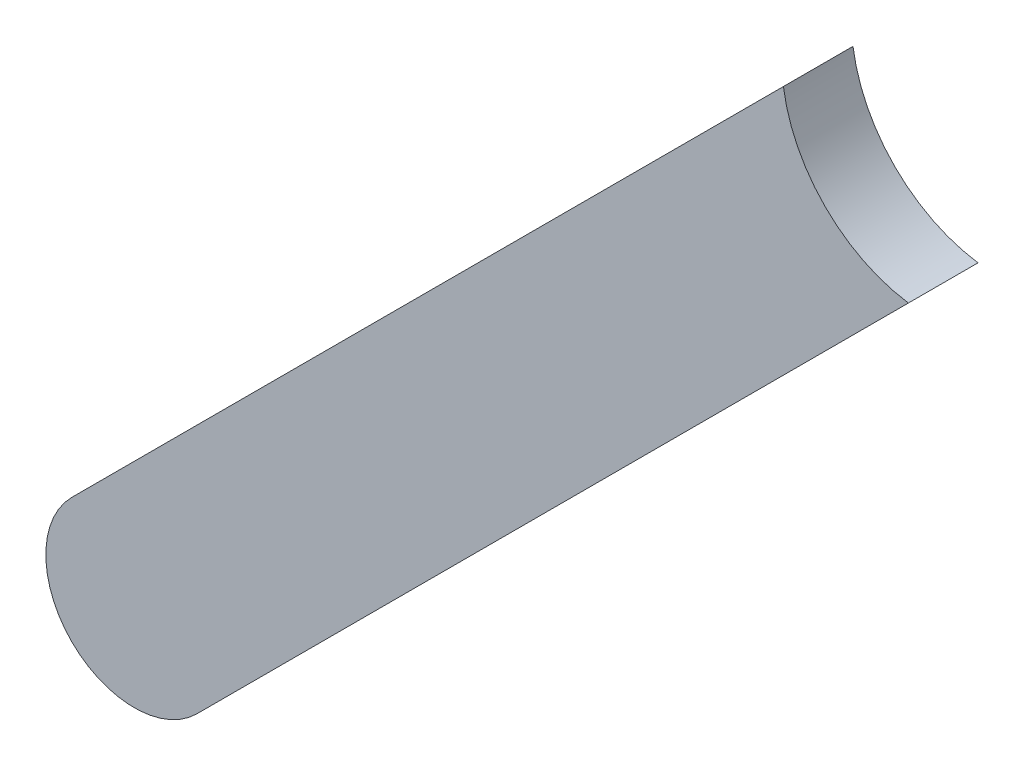
ISO-10303-21;
HEADER;
FILE_DESCRIPTION(('STEP AP214'),'2;1');
FILE_NAME('part.step','',(''),(''),'','','');
FILE_SCHEMA(('AUTOMOTIVE_DESIGN { 1 0 10303 214 1 1 1 1 }'));
ENDSEC;
DATA;
#1=APPLICATION_CONTEXT('core data for automotive mechanical design processes');
#2=APPLICATION_PROTOCOL_DEFINITION('international standard','automotive_design',2000,#1);
#3=PRODUCT_CONTEXT('',#1,'mechanical');
#4=PRODUCT('Part','Part','',(#3));
#5=PRODUCT_RELATED_PRODUCT_CATEGORY('part','',(#4));
#6=PRODUCT_DEFINITION_FORMATION('','',#4);
#7=PRODUCT_DEFINITION_CONTEXT('part definition',#1,'design');
#8=PRODUCT_DEFINITION('design','',#6,#7);
#9=PRODUCT_DEFINITION_SHAPE('','',#8);
#10=(LENGTH_UNIT() NAMED_UNIT(*) SI_UNIT(.MILLI.,.METRE.));
#11=(NAMED_UNIT(*) PLANE_ANGLE_UNIT() SI_UNIT($,.RADIAN.));
#12=(NAMED_UNIT(*) SI_UNIT($,.STERADIAN.) SOLID_ANGLE_UNIT());
#13=UNCERTAINTY_MEASURE_WITH_UNIT(LENGTH_MEASURE(1.E-05),#10,'distance_accuracy_value','');
#14=(GEOMETRIC_REPRESENTATION_CONTEXT(3) GLOBAL_UNCERTAINTY_ASSIGNED_CONTEXT((#13)) GLOBAL_UNIT_ASSIGNED_CONTEXT((#10,
#11,#12)) REPRESENTATION_CONTEXT('',''));
#15=CARTESIAN_POINT('',(0.,0.,0.));
#16=DIRECTION('',(0.,0.,1.));
#17=DIRECTION('',(1.,0.,0.));
#18=AXIS2_PLACEMENT_3D('',#15,#16,#17);
#19=CARTESIAN_POINT('',(135.81560594,106.11939406,0.));
#20=DIRECTION('',(-0.707106781186548,0.707106781186548,0.));
#21=DIRECTION('',(0.707106781186548,0.707106781186548,0.));
#22=AXIS2_PLACEMENT_3D('',#19,#20,#21);
#23=PLANE('',#22);
#24=DIRECTION('',(0.707106781186548,0.707106781186548,0.));
#25=VECTOR('',#24,1.);
#26=CARTESIAN_POINT('',(135.81560594,106.11939406,0.1999996));
#27=LINE('',#26,#25);
#28=CARTESIAN_POINT('',(135.81560594,106.11939406,0.1999996));
#29=VERTEX_POINT('',#28);
#30=CARTESIAN_POINT('',(137.86066116455,108.16444928455,0.1999996));
#31=VERTEX_POINT('',#30);
#32=EDGE_CURVE('E11',#29,#31,#27,.T.);
#33=ORIENTED_EDGE('',*,*,#32,.F.);
#34=DIRECTION('',(0.,0.,1.));
#35=VECTOR('',#34,1.);
#36=CARTESIAN_POINT('',(135.81560594,106.11939406,0.));
#37=LINE('',#36,#35);
#38=CARTESIAN_POINT('',(135.81560594,106.11939406,0.));
#39=VERTEX_POINT('',#38);
#40=EDGE_CURVE('E24',#39,#29,#37,.T.);
#41=ORIENTED_EDGE('',*,*,#40,.F.);
#42=DIRECTION('',(0.707106781186548,0.707106781186548,0.));
#43=VECTOR('',#42,1.);
#44=CARTESIAN_POINT('',(135.81560594,106.11939406,0.));
#45=LINE('',#44,#43);
#46=CARTESIAN_POINT('',(137.86066116455,108.16444928455,0.));
#47=VERTEX_POINT('',#46);
#48=EDGE_CURVE('E75',#39,#47,#45,.T.);
#49=ORIENTED_EDGE('',*,*,#48,.T.);
#50=DIRECTION('',(0.,0.,1.));
#51=VECTOR('',#50,1.);
#52=CARTESIAN_POINT('',(137.86066116455,108.16444928455,0.));
#53=LINE('',#52,#51);
#54=EDGE_CURVE('E37',#47,#31,#53,.T.);
#55=ORIENTED_EDGE('',*,*,#54,.T.);
#56=EDGE_LOOP('',(#33,#41,#49,#55));
#57=FACE_BOUND('',#56,.T.);
#58=ADVANCED_FACE('F17',(#57),#23,.F.);
#59=CARTESIAN_POINT('',(137.922,108.585,0.));
#60=DIRECTION('',(0.,0.,-1.));
#61=DIRECTION('',(1.,0.,0.));
#62=AXIS2_PLACEMENT_3D('',#59,#60,#61);
#63=CYLINDRICAL_SURFACE('',#62,0.42500042);
#64=DIRECTION('',(0.,0.,1.));
#65=VECTOR('',#64,1.);
#66=CARTESIAN_POINT('',(137.50144928455,108.52366116455,0.));
#67=LINE('',#66,#65);
#68=CARTESIAN_POINT('',(137.50144928455,108.52366116455,0.));
#69=VERTEX_POINT('',#68);
#70=CARTESIAN_POINT('',(137.50144928455,108.52366116455,0.1999996));
#71=VERTEX_POINT('',#70);
#72=EDGE_CURVE('E67',#69,#71,#67,.T.);
#73=ORIENTED_EDGE('',*,*,#72,.T.);
#74=CARTESIAN_POINT('',(137.922,108.585,0.1999996));
#75=DIRECTION('',(0.,0.,1.));
#76=DIRECTION('',(1.,0.,0.));
#77=AXIS2_PLACEMENT_3D('',#74,#75,#76);
#78=CIRCLE('',#77,0.42500042);
#79=EDGE_CURVE('E82',#71,#31,#78,.T.);
#80=ORIENTED_EDGE('',*,*,#79,.T.);
#81=ORIENTED_EDGE('',*,*,#54,.F.);
#82=CARTESIAN_POINT('',(137.922,108.585,0.));
#83=DIRECTION('',(0.,0.,1.));
#84=DIRECTION('',(1.,0.,0.));
#85=AXIS2_PLACEMENT_3D('',#82,#83,#84);
#86=CIRCLE('',#85,0.42500042);
#87=EDGE_CURVE('E80',#69,#47,#86,.T.);
#88=ORIENTED_EDGE('',*,*,#87,.F.);
#89=EDGE_LOOP('',(#73,#80,#81,#88));
#90=FACE_BOUND('',#89,.T.);
#91=ADVANCED_FACE('F88',(#90),#63,.F.);
#92=CARTESIAN_POINT('',(137.50144928455,108.52366116455,0.));
#93=DIRECTION('',(0.707106781186548,-0.707106781186548,0.));
#94=DIRECTION('',(-0.707106781186548,-0.707106781186548,0.));
#95=AXIS2_PLACEMENT_3D('',#92,#93,#94);
#96=PLANE('',#95);
#97=DIRECTION('',(-0.707106781186548,-0.707106781186548,0.));
#98=VECTOR('',#97,1.);
#99=CARTESIAN_POINT('',(137.74239406,108.76460594,0.1999996));
#100=LINE('',#99,#98);
#101=CARTESIAN_POINT('',(135.45639406,106.47860594,0.1999996));
#102=VERTEX_POINT('',#101);
#103=EDGE_CURVE('E71',#71,#102,#100,.T.);
#104=ORIENTED_EDGE('',*,*,#103,.F.);
#105=ORIENTED_EDGE('',*,*,#72,.F.);
#106=DIRECTION('',(-0.707106781186548,-0.707106781186548,0.));
#107=VECTOR('',#106,1.);
#108=CARTESIAN_POINT('',(137.74239406,108.76460594,0.));
#109=LINE('',#108,#107);
#110=CARTESIAN_POINT('',(135.45639406,106.47860594,0.));
#111=VERTEX_POINT('',#110);
#112=EDGE_CURVE('E63',#69,#111,#109,.T.);
#113=ORIENTED_EDGE('',*,*,#112,.T.);
#114=DIRECTION('',(0.,0.,1.));
#115=VECTOR('',#114,1.);
#116=CARTESIAN_POINT('',(135.45639406,106.47860594,0.));
#117=LINE('',#116,#115);
#118=EDGE_CURVE('E53',#111,#102,#117,.T.);
#119=ORIENTED_EDGE('',*,*,#118,.T.);
#120=EDGE_LOOP('',(#104,#105,#113,#119));
#121=FACE_BOUND('',#120,.T.);
#122=ADVANCED_FACE('F66',(#121),#96,.F.);
#123=CARTESIAN_POINT('',(135.636,106.299,0.));
#124=DIRECTION('',(0.,0.,-1.));
#125=DIRECTION('',(-0.70710678118652,0.707106781186576,0.));
#126=AXIS2_PLACEMENT_3D('',#123,#124,#125);
#127=CYLINDRICAL_SURFACE('',#126,0.254001156230768);
#128=CARTESIAN_POINT('',(135.636,106.299,0.1999996));
#129=DIRECTION('',(0.,0.,1.));
#130=DIRECTION('',(-0.70710678118652,0.707106781186576,0.));
#131=AXIS2_PLACEMENT_3D('',#128,#129,#130);
#132=CIRCLE('',#131,0.254001156230768);
#133=EDGE_CURVE('E59',#102,#29,#132,.T.);
#134=ORIENTED_EDGE('',*,*,#133,.F.);
#135=ORIENTED_EDGE('',*,*,#118,.F.);
#136=CARTESIAN_POINT('',(135.636,106.299,0.));
#137=DIRECTION('',(0.,0.,1.));
#138=DIRECTION('',(-0.70710678118652,0.707106781186576,0.));
#139=AXIS2_PLACEMENT_3D('',#136,#137,#138);
#140=CIRCLE('',#139,0.254001156230768);
#141=EDGE_CURVE('E57',#111,#39,#140,.T.);
#142=ORIENTED_EDGE('',*,*,#141,.T.);
#143=ORIENTED_EDGE('',*,*,#40,.T.);
#144=EDGE_LOOP('',(#134,#135,#142,#143));
#145=FACE_BOUND('',#144,.T.);
#146=ADVANCED_FACE('F55',(#145),#127,.T.);
#147=CARTESIAN_POINT('',(135.81560594,106.11939406,0.));
#148=DIRECTION('',(0.,0.,-1.));
#149=DIRECTION('',(-1.,0.,0.));
#150=AXIS2_PLACEMENT_3D('',#147,#148,#149);
#151=PLANE('',#150);
#152=ORIENTED_EDGE('',*,*,#48,.F.);
#153=ORIENTED_EDGE('',*,*,#141,.F.);
#154=ORIENTED_EDGE('',*,*,#112,.F.);
#155=ORIENTED_EDGE('',*,*,#87,.T.);
#156=EDGE_LOOP('',(#152,#153,#154,#155));
#157=FACE_BOUND('',#156,.T.);
#158=ADVANCED_FACE('F74',(#157),#151,.T.);
#159=CARTESIAN_POINT('',(135.81560594,106.11939406,0.1999996));
#160=DIRECTION('',(0.,0.,-1.));
#161=DIRECTION('',(-1.,0.,0.));
#162=AXIS2_PLACEMENT_3D('',#159,#160,#161);
#163=PLANE('',#162);
#164=ORIENTED_EDGE('',*,*,#133,.T.);
#165=ORIENTED_EDGE('',*,*,#32,.T.);
#166=ORIENTED_EDGE('',*,*,#79,.F.);
#167=ORIENTED_EDGE('',*,*,#103,.T.);
#168=EDGE_LOOP('',(#164,#165,#166,#167));
#169=FACE_BOUND('',#168,.T.);
#170=ADVANCED_FACE('F91',(#169),#163,.F.);
#171=CLOSED_SHELL('',(#58,#91,#122,#146,#158,#170));
#172=MANIFOLD_SOLID_BREP('B1',#171);
#173=ADVANCED_BREP_SHAPE_REPRESENTATION('',(#18,#172),#14);
#174=SHAPE_DEFINITION_REPRESENTATION(#9,#173);
ENDSEC;
END-ISO-10303-21;
